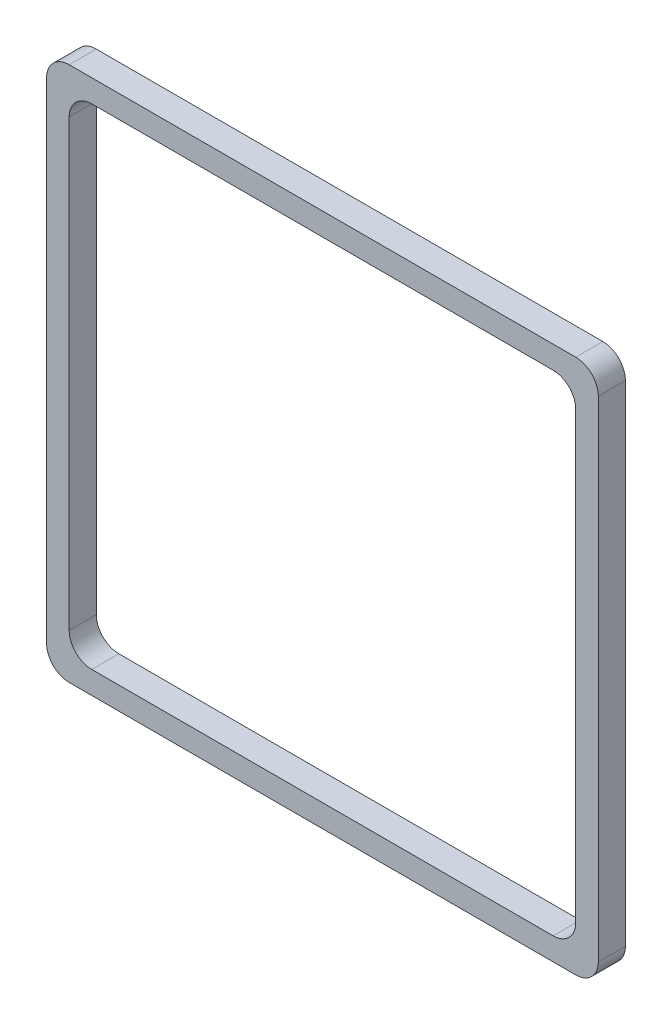
ISO-10303-21;
HEADER;
FILE_DESCRIPTION(('STEP AP214'),'2;1');
FILE_NAME('part.step','',(''),(''),'','','');
FILE_SCHEMA(('AUTOMOTIVE_DESIGN { 1 0 10303 214 1 1 1 1 }'));
ENDSEC;
DATA;
#1=APPLICATION_CONTEXT('core data for automotive mechanical design processes');
#2=APPLICATION_PROTOCOL_DEFINITION('international standard','automotive_design',2000,#1);
#3=PRODUCT_CONTEXT('',#1,'mechanical');
#4=PRODUCT('Part','Part','',(#3));
#5=PRODUCT_RELATED_PRODUCT_CATEGORY('part','',(#4));
#6=PRODUCT_DEFINITION_FORMATION('','',#4);
#7=PRODUCT_DEFINITION_CONTEXT('part definition',#1,'design');
#8=PRODUCT_DEFINITION('design','',#6,#7);
#9=PRODUCT_DEFINITION_SHAPE('','',#8);
#10=(LENGTH_UNIT() NAMED_UNIT(*) SI_UNIT(.MILLI.,.METRE.));
#11=(NAMED_UNIT(*) PLANE_ANGLE_UNIT() SI_UNIT($,.RADIAN.));
#12=(NAMED_UNIT(*) SI_UNIT($,.STERADIAN.) SOLID_ANGLE_UNIT());
#13=UNCERTAINTY_MEASURE_WITH_UNIT(LENGTH_MEASURE(1.E-05),#10,'distance_accuracy_value','');
#14=(GEOMETRIC_REPRESENTATION_CONTEXT(3) GLOBAL_UNCERTAINTY_ASSIGNED_CONTEXT((#13)) GLOBAL_UNIT_ASSIGNED_CONTEXT((#10,
#11,#12)) REPRESENTATION_CONTEXT('',''));
#15=CARTESIAN_POINT('',(0.,0.,0.));
#16=DIRECTION('',(0.,0.,1.));
#17=DIRECTION('',(1.,0.,0.));
#18=AXIS2_PLACEMENT_3D('',#15,#16,#17);
#19=CARTESIAN_POINT('',(204.104097522911,177.840896345193,12.));
#20=DIRECTION('',(0.,0.,-1.));
#21=DIRECTION('',(-1.,0.,0.));
#22=AXIS2_PLACEMENT_3D('',#19,#20,#21);
#23=PLANE('',#22);
#24=CARTESIAN_POINT('',(204.104097522911,177.840896345193,12.));
#25=DIRECTION('',(0.,0.,1.));
#26=DIRECTION('',(-1.,0.,0.));
#27=AXIS2_PLACEMENT_3D('',#24,#25,#26);
#28=CIRCLE('',#27,10.);
#29=CARTESIAN_POINT('',(214.104097522911,177.840896345193,12.));
#30=VERTEX_POINT('',#29);
#31=CARTESIAN_POINT('',(204.104097522911,187.840896345193,12.));
#32=VERTEX_POINT('',#31);
#33=EDGE_CURVE('E242',#30,#32,#28,.T.);
#34=ORIENTED_EDGE('',*,*,#33,.T.);
#35=DIRECTION('',(-1.,0.,0.));
#36=VECTOR('',#35,1.);
#37=CARTESIAN_POINT('',(-20.195902477089,187.840896345193,12.));
#38=LINE('',#37,#36);
#39=CARTESIAN_POINT('',(-20.195902477089,187.840896345193,12.));
#40=VERTEX_POINT('',#39);
#41=EDGE_CURVE('E246',#32,#40,#38,.T.);
#42=ORIENTED_EDGE('',*,*,#41,.T.);
#43=CARTESIAN_POINT('',(-20.195902477089,177.840896345193,12.));
#44=DIRECTION('',(0.,0.,1.));
#45=DIRECTION('',(1.,0.,0.));
#46=AXIS2_PLACEMENT_3D('',#43,#44,#45);
#47=CIRCLE('',#46,9.99999999999999);
#48=CARTESIAN_POINT('',(-30.195902477089,177.840896345193,12.));
#49=VERTEX_POINT('',#48);
#50=EDGE_CURVE('E250',#40,#49,#47,.T.);
#51=ORIENTED_EDGE('',*,*,#50,.T.);
#52=DIRECTION('',(0.,-1.,0.));
#53=VECTOR('',#52,1.);
#54=CARTESIAN_POINT('',(-30.195902477089,177.840896345193,12.));
#55=LINE('',#54,#53);
#56=CARTESIAN_POINT('',(-30.195902477089,-39.0591036548066,12.));
#57=VERTEX_POINT('',#56);
#58=EDGE_CURVE('E253',#49,#57,#55,.T.);
#59=ORIENTED_EDGE('',*,*,#58,.T.);
#60=CARTESIAN_POINT('',(-20.195902477089,-39.0591036548066,12.));
#61=DIRECTION('',(0.,0.,1.));
#62=DIRECTION('',(1.,0.,0.));
#63=AXIS2_PLACEMENT_3D('',#60,#61,#62);
#64=CIRCLE('',#63,10.);
#65=CARTESIAN_POINT('',(-20.195902477089,-49.0591036548066,12.));
#66=VERTEX_POINT('',#65);
#67=EDGE_CURVE('E256',#57,#66,#64,.T.);
#68=ORIENTED_EDGE('',*,*,#67,.T.);
#69=DIRECTION('',(1.,0.,0.));
#70=VECTOR('',#69,1.);
#71=CARTESIAN_POINT('',(-20.195902477089,-49.0591036548066,12.));
#72=LINE('',#71,#70);
#73=CARTESIAN_POINT('',(204.104097522911,-49.0591036548066,12.));
#74=VERTEX_POINT('',#73);
#75=EDGE_CURVE('E259',#66,#74,#72,.T.);
#76=ORIENTED_EDGE('',*,*,#75,.T.);
#77=CARTESIAN_POINT('',(204.104097522911,-39.0591036548066,12.));
#78=DIRECTION('',(0.,0.,1.));
#79=DIRECTION('',(1.,0.,0.));
#80=AXIS2_PLACEMENT_3D('',#77,#78,#79);
#81=CIRCLE('',#80,10.);
#82=CARTESIAN_POINT('',(214.104097522911,-39.0591036548066,12.));
#83=VERTEX_POINT('',#82);
#84=EDGE_CURVE('E262',#74,#83,#81,.T.);
#85=ORIENTED_EDGE('',*,*,#84,.T.);
#86=DIRECTION('',(0.,1.,0.));
#87=VECTOR('',#86,1.);
#88=CARTESIAN_POINT('',(214.104097522911,177.840896345193,12.));
#89=LINE('',#88,#87);
#90=EDGE_CURVE('E265',#83,#30,#89,.T.);
#91=ORIENTED_EDGE('',*,*,#90,.T.);
#92=EDGE_LOOP('',(#34,#42,#51,#59,#68,#76,#85,#91));
#93=FACE_BOUND('',#92,.T.);
#94=CARTESIAN_POINT('',(194.104097522911,-29.0591036548066,12.));
#95=DIRECTION('',(0.,0.,1.));
#96=DIRECTION('',(1.,0.,0.));
#97=AXIS2_PLACEMENT_3D('',#94,#95,#96);
#98=CIRCLE('',#97,10.);
#99=CARTESIAN_POINT('',(194.104097522911,-39.0591036548066,12.));
#100=VERTEX_POINT('',#99);
#101=CARTESIAN_POINT('',(204.104097522911,-29.0591036548066,12.));
#102=VERTEX_POINT('',#101);
#103=EDGE_CURVE('E153',#100,#102,#98,.T.);
#104=ORIENTED_EDGE('',*,*,#103,.F.);
#105=DIRECTION('',(1.,0.,0.));
#106=VECTOR('',#105,1.);
#107=CARTESIAN_POINT('',(-10.195902477089,-39.0591036548066,12.));
#108=LINE('',#107,#106);
#109=CARTESIAN_POINT('',(-10.195902477089,-39.0591036548066,12.));
#110=VERTEX_POINT('',#109);
#111=EDGE_CURVE('E194',#110,#100,#108,.T.);
#112=ORIENTED_EDGE('',*,*,#111,.F.);
#113=CARTESIAN_POINT('',(-10.195902477089,-29.0591036548066,12.));
#114=DIRECTION('',(0.,0.,1.));
#115=DIRECTION('',(1.,0.,0.));
#116=AXIS2_PLACEMENT_3D('',#113,#114,#115);
#117=CIRCLE('',#116,10.);
#118=CARTESIAN_POINT('',(-20.195902477089,-29.0591036548066,12.));
#119=VERTEX_POINT('',#118);
#120=EDGE_CURVE('E191',#119,#110,#117,.T.);
#121=ORIENTED_EDGE('',*,*,#120,.F.);
#122=DIRECTION('',(0.,-1.,0.));
#123=VECTOR('',#122,1.);
#124=CARTESIAN_POINT('',(-20.195902477089,167.840896345193,12.));
#125=LINE('',#124,#123);
#126=CARTESIAN_POINT('',(-20.195902477089,167.840896345193,12.));
#127=VERTEX_POINT('',#126);
#128=EDGE_CURVE('E188',#127,#119,#125,.T.);
#129=ORIENTED_EDGE('',*,*,#128,.F.);
#130=CARTESIAN_POINT('',(-10.195902477089,167.840896345193,12.));
#131=DIRECTION('',(0.,0.,1.));
#132=DIRECTION('',(1.,0.,0.));
#133=AXIS2_PLACEMENT_3D('',#130,#131,#132);
#134=CIRCLE('',#133,10.);
#135=CARTESIAN_POINT('',(-10.195902477089,177.840896345193,12.));
#136=VERTEX_POINT('',#135);
#137=EDGE_CURVE('E185',#136,#127,#134,.T.);
#138=ORIENTED_EDGE('',*,*,#137,.F.);
#139=DIRECTION('',(-1.,0.,0.));
#140=VECTOR('',#139,1.);
#141=CARTESIAN_POINT('',(-10.195902477089,177.840896345193,12.));
#142=LINE('',#141,#140);
#143=CARTESIAN_POINT('',(194.104097522911,177.840896345193,12.));
#144=VERTEX_POINT('',#143);
#145=EDGE_CURVE('E180',#144,#136,#142,.T.);
#146=ORIENTED_EDGE('',*,*,#145,.F.);
#147=CARTESIAN_POINT('',(194.104097522911,167.840896345193,12.));
#148=DIRECTION('',(0.,0.,1.));
#149=DIRECTION('',(-1.,0.,0.));
#150=AXIS2_PLACEMENT_3D('',#147,#148,#149);
#151=CIRCLE('',#150,10.);
#152=CARTESIAN_POINT('',(204.104097522911,167.840896345193,12.));
#153=VERTEX_POINT('',#152);
#154=EDGE_CURVE('E176',#153,#144,#151,.T.);
#155=ORIENTED_EDGE('',*,*,#154,.F.);
#156=DIRECTION('',(0.,1.,0.));
#157=VECTOR('',#156,1.);
#158=CARTESIAN_POINT('',(204.104097522911,167.840896345193,12.));
#159=LINE('',#158,#157);
#160=EDGE_CURVE('E162',#102,#153,#159,.T.);
#161=ORIENTED_EDGE('',*,*,#160,.F.);
#162=EDGE_LOOP('',(#104,#112,#121,#129,#138,#146,#155,#161));
#163=FACE_BOUND('',#162,.T.);
#164=ADVANCED_FACE('F39',(#93,#163),#23,.F.);
#165=CARTESIAN_POINT('',(204.104097522911,177.840896345193,0.));
#166=DIRECTION('',(0.,0.,-1.));
#167=DIRECTION('',(-1.,0.,0.));
#168=AXIS2_PLACEMENT_3D('',#165,#166,#167);
#169=PLANE('',#168);
#170=CARTESIAN_POINT('',(204.104097522911,177.840896345193,0.));
#171=DIRECTION('',(0.,0.,1.));
#172=DIRECTION('',(-1.,0.,0.));
#173=AXIS2_PLACEMENT_3D('',#170,#171,#172);
#174=CIRCLE('',#173,10.);
#175=CARTESIAN_POINT('',(214.104097522911,177.840896345193,0.));
#176=VERTEX_POINT('',#175);
#177=CARTESIAN_POINT('',(204.104097522911,187.840896345193,0.));
#178=VERTEX_POINT('',#177);
#179=EDGE_CURVE('E171',#176,#178,#174,.T.);
#180=ORIENTED_EDGE('',*,*,#179,.F.);
#181=DIRECTION('',(0.,1.,0.));
#182=VECTOR('',#181,1.);
#183=CARTESIAN_POINT('',(214.104097522911,177.840896345193,0.));
#184=LINE('',#183,#182);
#185=CARTESIAN_POINT('',(214.104097522911,-39.0591036548066,0.));
#186=VERTEX_POINT('',#185);
#187=EDGE_CURVE('E247',#186,#176,#184,.T.);
#188=ORIENTED_EDGE('',*,*,#187,.F.);
#189=CARTESIAN_POINT('',(204.104097522911,-39.0591036548066,0.));
#190=DIRECTION('',(0.,0.,1.));
#191=DIRECTION('',(1.,0.,0.));
#192=AXIS2_PLACEMENT_3D('',#189,#190,#191);
#193=CIRCLE('',#192,10.);
#194=CARTESIAN_POINT('',(204.104097522911,-49.0591036548066,0.));
#195=VERTEX_POINT('',#194);
#196=EDGE_CURVE('E287',#195,#186,#193,.T.);
#197=ORIENTED_EDGE('',*,*,#196,.F.);
#198=DIRECTION('',(1.,0.,0.));
#199=VECTOR('',#198,1.);
#200=CARTESIAN_POINT('',(-20.195902477089,-49.0591036548066,0.));
#201=LINE('',#200,#199);
#202=CARTESIAN_POINT('',(-20.195902477089,-49.0591036548066,0.));
#203=VERTEX_POINT('',#202);
#204=EDGE_CURVE('E284',#203,#195,#201,.T.);
#205=ORIENTED_EDGE('',*,*,#204,.F.);
#206=CARTESIAN_POINT('',(-20.195902477089,-39.0591036548066,0.));
#207=DIRECTION('',(0.,0.,1.));
#208=DIRECTION('',(1.,0.,0.));
#209=AXIS2_PLACEMENT_3D('',#206,#207,#208);
#210=CIRCLE('',#209,10.);
#211=CARTESIAN_POINT('',(-30.195902477089,-39.0591036548066,0.));
#212=VERTEX_POINT('',#211);
#213=EDGE_CURVE('E281',#212,#203,#210,.T.);
#214=ORIENTED_EDGE('',*,*,#213,.F.);
#215=DIRECTION('',(0.,-1.,0.));
#216=VECTOR('',#215,1.);
#217=CARTESIAN_POINT('',(-30.195902477089,177.840896345193,0.));
#218=LINE('',#217,#216);
#219=CARTESIAN_POINT('',(-30.195902477089,177.840896345193,0.));
#220=VERTEX_POINT('',#219);
#221=EDGE_CURVE('E278',#220,#212,#218,.T.);
#222=ORIENTED_EDGE('',*,*,#221,.F.);
#223=CARTESIAN_POINT('',(-20.195902477089,177.840896345193,0.));
#224=DIRECTION('',(0.,0.,1.));
#225=DIRECTION('',(1.,0.,0.));
#226=AXIS2_PLACEMENT_3D('',#223,#224,#225);
#227=CIRCLE('',#226,9.99999999999999);
#228=CARTESIAN_POINT('',(-20.195902477089,187.840896345193,0.));
#229=VERTEX_POINT('',#228);
#230=EDGE_CURVE('E275',#229,#220,#227,.T.);
#231=ORIENTED_EDGE('',*,*,#230,.F.);
#232=DIRECTION('',(-1.,0.,0.));
#233=VECTOR('',#232,1.);
#234=CARTESIAN_POINT('',(-20.195902477089,187.840896345193,0.));
#235=LINE('',#234,#233);
#236=EDGE_CURVE('E272',#178,#229,#235,.T.);
#237=ORIENTED_EDGE('',*,*,#236,.F.);
#238=EDGE_LOOP('',(#180,#188,#197,#205,#214,#222,#231,#237));
#239=FACE_BOUND('',#238,.T.);
#240=DIRECTION('',(1.,0.,0.));
#241=VECTOR('',#240,1.);
#242=CARTESIAN_POINT('',(-10.195902477089,-39.0591036548066,0.));
#243=LINE('',#242,#241);
#244=CARTESIAN_POINT('',(-10.195902477089,-39.0591036548066,0.));
#245=VERTEX_POINT('',#244);
#246=CARTESIAN_POINT('',(194.104097522911,-39.0591036548066,0.));
#247=VERTEX_POINT('',#246);
#248=EDGE_CURVE('E163',#245,#247,#243,.T.);
#249=ORIENTED_EDGE('',*,*,#248,.T.);
#250=CARTESIAN_POINT('',(194.104097522911,-29.0591036548066,0.));
#251=DIRECTION('',(0.,0.,1.));
#252=DIRECTION('',(1.,0.,0.));
#253=AXIS2_PLACEMENT_3D('',#250,#251,#252);
#254=CIRCLE('',#253,10.);
#255=CARTESIAN_POINT('',(204.104097522911,-29.0591036548066,0.));
#256=VERTEX_POINT('',#255);
#257=EDGE_CURVE('E63',#247,#256,#254,.T.);
#258=ORIENTED_EDGE('',*,*,#257,.T.);
#259=DIRECTION('',(0.,1.,0.));
#260=VECTOR('',#259,1.);
#261=CARTESIAN_POINT('',(204.104097522911,167.840896345193,0.));
#262=LINE('',#261,#260);
#263=CARTESIAN_POINT('',(204.104097522911,167.840896345193,0.));
#264=VERTEX_POINT('',#263);
#265=EDGE_CURVE('E169',#256,#264,#262,.T.);
#266=ORIENTED_EDGE('',*,*,#265,.T.);
#267=CARTESIAN_POINT('',(194.104097522911,167.840896345193,0.));
#268=DIRECTION('',(0.,0.,1.));
#269=DIRECTION('',(-1.,0.,0.));
#270=AXIS2_PLACEMENT_3D('',#267,#268,#269);
#271=CIRCLE('',#270,10.);
#272=CARTESIAN_POINT('',(194.104097522911,177.840896345193,0.));
#273=VERTEX_POINT('',#272);
#274=EDGE_CURVE('E201',#264,#273,#271,.T.);
#275=ORIENTED_EDGE('',*,*,#274,.T.);
#276=DIRECTION('',(-1.,0.,0.));
#277=VECTOR('',#276,1.);
#278=CARTESIAN_POINT('',(-10.195902477089,177.840896345193,0.));
#279=LINE('',#278,#277);
#280=CARTESIAN_POINT('',(-10.195902477089,177.840896345193,0.));
#281=VERTEX_POINT('',#280);
#282=EDGE_CURVE('E205',#273,#281,#279,.T.);
#283=ORIENTED_EDGE('',*,*,#282,.T.);
#284=CARTESIAN_POINT('',(-10.195902477089,167.840896345193,0.));
#285=DIRECTION('',(0.,0.,1.));
#286=DIRECTION('',(1.,0.,0.));
#287=AXIS2_PLACEMENT_3D('',#284,#285,#286);
#288=CIRCLE('',#287,10.);
#289=CARTESIAN_POINT('',(-20.195902477089,167.840896345193,0.));
#290=VERTEX_POINT('',#289);
#291=EDGE_CURVE('E209',#281,#290,#288,.T.);
#292=ORIENTED_EDGE('',*,*,#291,.T.);
#293=DIRECTION('',(0.,-1.,0.));
#294=VECTOR('',#293,1.);
#295=CARTESIAN_POINT('',(-20.195902477089,167.840896345193,0.));
#296=LINE('',#295,#294);
#297=CARTESIAN_POINT('',(-20.195902477089,-29.0591036548066,0.));
#298=VERTEX_POINT('',#297);
#299=EDGE_CURVE('E213',#290,#298,#296,.T.);
#300=ORIENTED_EDGE('',*,*,#299,.T.);
#301=CARTESIAN_POINT('',(-10.195902477089,-29.0591036548066,0.));
#302=DIRECTION('',(0.,0.,1.));
#303=DIRECTION('',(1.,0.,0.));
#304=AXIS2_PLACEMENT_3D('',#301,#302,#303);
#305=CIRCLE('',#304,10.);
#306=EDGE_CURVE('E217',#298,#245,#305,.T.);
#307=ORIENTED_EDGE('',*,*,#306,.T.);
#308=EDGE_LOOP('',(#249,#258,#266,#275,#283,#292,#300,#307));
#309=FACE_BOUND('',#308,.T.);
#310=ADVANCED_FACE('F326',(#239,#309),#169,.T.);
#311=CARTESIAN_POINT('',(204.104097522911,177.840896345193,12.));
#312=DIRECTION('',(0.,0.,-1.));
#313=DIRECTION('',(-1.,0.,0.));
#314=AXIS2_PLACEMENT_3D('',#311,#312,#313);
#315=CYLINDRICAL_SURFACE('',#314,10.);
#316=ORIENTED_EDGE('',*,*,#179,.T.);
#317=DIRECTION('',(0.,0.,-1.));
#318=VECTOR('',#317,1.);
#319=CARTESIAN_POINT('',(204.104097522911,187.840896345193,12.));
#320=LINE('',#319,#318);
#321=EDGE_CURVE('E11',#32,#178,#320,.T.);
#322=ORIENTED_EDGE('',*,*,#321,.F.);
#323=ORIENTED_EDGE('',*,*,#33,.F.);
#324=DIRECTION('',(0.,0.,-1.));
#325=VECTOR('',#324,1.);
#326=CARTESIAN_POINT('',(214.104097522911,177.840896345193,12.));
#327=LINE('',#326,#325);
#328=EDGE_CURVE('E268',#30,#176,#327,.T.);
#329=ORIENTED_EDGE('',*,*,#328,.T.);
#330=EDGE_LOOP('',(#316,#322,#323,#329));
#331=FACE_BOUND('',#330,.T.);
#332=ADVANCED_FACE('F41',(#331),#315,.T.);
#333=CARTESIAN_POINT('',(-20.195902477089,187.840896345193,12.));
#334=DIRECTION('',(0.,-1.,0.));
#335=DIRECTION('',(0.,0.,-1.));
#336=AXIS2_PLACEMENT_3D('',#333,#334,#335);
#337=PLANE('',#336);
#338=ORIENTED_EDGE('',*,*,#236,.T.);
#339=DIRECTION('',(0.,0.,-1.));
#340=VECTOR('',#339,1.);
#341=CARTESIAN_POINT('',(-20.195902477089,187.840896345193,12.));
#342=LINE('',#341,#340);
#343=EDGE_CURVE('E48',#40,#229,#342,.T.);
#344=ORIENTED_EDGE('',*,*,#343,.F.);
#345=ORIENTED_EDGE('',*,*,#41,.F.);
#346=ORIENTED_EDGE('',*,*,#321,.T.);
#347=EDGE_LOOP('',(#338,#344,#345,#346));
#348=FACE_BOUND('',#347,.T.);
#349=ADVANCED_FACE('F343',(#348),#337,.F.);
#350=CARTESIAN_POINT('',(-20.195902477089,177.840896345193,12.));
#351=DIRECTION('',(0.,0.,-1.));
#352=DIRECTION('',(-1.,0.,0.));
#353=AXIS2_PLACEMENT_3D('',#350,#351,#352);
#354=CYLINDRICAL_SURFACE('',#353,9.99999999999999);
#355=ORIENTED_EDGE('',*,*,#230,.T.);
#356=DIRECTION('',(0.,0.,-1.));
#357=VECTOR('',#356,1.);
#358=CARTESIAN_POINT('',(-30.195902477089,177.840896345193,12.));
#359=LINE('',#358,#357);
#360=EDGE_CURVE('E311',#49,#220,#359,.T.);
#361=ORIENTED_EDGE('',*,*,#360,.F.);
#362=ORIENTED_EDGE('',*,*,#50,.F.);
#363=ORIENTED_EDGE('',*,*,#343,.T.);
#364=EDGE_LOOP('',(#355,#361,#362,#363));
#365=FACE_BOUND('',#364,.T.);
#366=ADVANCED_FACE('F320',(#365),#354,.T.);
#367=CARTESIAN_POINT('',(-30.195902477089,177.840896345193,12.));
#368=DIRECTION('',(1.,0.,0.));
#369=DIRECTION('',(0.,1.,0.));
#370=AXIS2_PLACEMENT_3D('',#367,#368,#369);
#371=PLANE('',#370);
#372=ORIENTED_EDGE('',*,*,#221,.T.);
#373=DIRECTION('',(0.,0.,-1.));
#374=VECTOR('',#373,1.);
#375=CARTESIAN_POINT('',(-30.195902477089,-39.0591036548066,12.));
#376=LINE('',#375,#374);
#377=EDGE_CURVE('E307',#57,#212,#376,.T.);
#378=ORIENTED_EDGE('',*,*,#377,.F.);
#379=ORIENTED_EDGE('',*,*,#58,.F.);
#380=ORIENTED_EDGE('',*,*,#360,.T.);
#381=EDGE_LOOP('',(#372,#378,#379,#380));
#382=FACE_BOUND('',#381,.T.);
#383=ADVANCED_FACE('F332',(#382),#371,.F.);
#384=CARTESIAN_POINT('',(-20.195902477089,-39.0591036548066,12.));
#385=DIRECTION('',(0.,0.,-1.));
#386=DIRECTION('',(-1.,0.,0.));
#387=AXIS2_PLACEMENT_3D('',#384,#385,#386);
#388=CYLINDRICAL_SURFACE('',#387,10.);
#389=ORIENTED_EDGE('',*,*,#213,.T.);
#390=DIRECTION('',(0.,0.,-1.));
#391=VECTOR('',#390,1.);
#392=CARTESIAN_POINT('',(-20.195902477089,-49.0591036548066,12.));
#393=LINE('',#392,#391);
#394=EDGE_CURVE('E303',#66,#203,#393,.T.);
#395=ORIENTED_EDGE('',*,*,#394,.F.);
#396=ORIENTED_EDGE('',*,*,#67,.F.);
#397=ORIENTED_EDGE('',*,*,#377,.T.);
#398=EDGE_LOOP('',(#389,#395,#396,#397));
#399=FACE_BOUND('',#398,.T.);
#400=ADVANCED_FACE('F336',(#399),#388,.T.);
#401=CARTESIAN_POINT('',(-20.195902477089,-49.0591036548066,12.));
#402=DIRECTION('',(0.,1.,0.));
#403=DIRECTION('',(-1.,0.,0.));
#404=AXIS2_PLACEMENT_3D('',#401,#402,#403);
#405=PLANE('',#404);
#406=ORIENTED_EDGE('',*,*,#204,.T.);
#407=DIRECTION('',(0.,0.,-1.));
#408=VECTOR('',#407,1.);
#409=CARTESIAN_POINT('',(204.104097522911,-49.0591036548066,12.));
#410=LINE('',#409,#408);
#411=EDGE_CURVE('E299',#74,#195,#410,.T.);
#412=ORIENTED_EDGE('',*,*,#411,.F.);
#413=ORIENTED_EDGE('',*,*,#75,.F.);
#414=ORIENTED_EDGE('',*,*,#394,.T.);
#415=EDGE_LOOP('',(#406,#412,#413,#414));
#416=FACE_BOUND('',#415,.T.);
#417=ADVANCED_FACE('F356',(#416),#405,.F.);
#418=CARTESIAN_POINT('',(204.104097522911,-39.0591036548066,12.));
#419=DIRECTION('',(0.,0.,-1.));
#420=DIRECTION('',(-1.,0.,0.));
#421=AXIS2_PLACEMENT_3D('',#418,#419,#420);
#422=CYLINDRICAL_SURFACE('',#421,10.);
#423=ORIENTED_EDGE('',*,*,#196,.T.);
#424=DIRECTION('',(0.,0.,-1.));
#425=VECTOR('',#424,1.);
#426=CARTESIAN_POINT('',(214.104097522911,-39.0591036548066,12.));
#427=LINE('',#426,#425);
#428=EDGE_CURVE('E295',#83,#186,#427,.T.);
#429=ORIENTED_EDGE('',*,*,#428,.F.);
#430=ORIENTED_EDGE('',*,*,#84,.F.);
#431=ORIENTED_EDGE('',*,*,#411,.T.);
#432=EDGE_LOOP('',(#423,#429,#430,#431));
#433=FACE_BOUND('',#432,.T.);
#434=ADVANCED_FACE('F354',(#433),#422,.T.);
#435=CARTESIAN_POINT('',(214.104097522911,177.840896345193,12.));
#436=DIRECTION('',(-1.,0.,0.));
#437=DIRECTION('',(0.,-1.,0.));
#438=AXIS2_PLACEMENT_3D('',#435,#436,#437);
#439=PLANE('',#438);
#440=ORIENTED_EDGE('',*,*,#187,.T.);
#441=ORIENTED_EDGE('',*,*,#328,.F.);
#442=ORIENTED_EDGE('',*,*,#90,.F.);
#443=ORIENTED_EDGE('',*,*,#428,.T.);
#444=EDGE_LOOP('',(#440,#441,#442,#443));
#445=FACE_BOUND('',#444,.T.);
#446=ADVANCED_FACE('F349',(#445),#439,.F.);
#447=CARTESIAN_POINT('',(194.104097522911,-29.0591036548066,12.));
#448=DIRECTION('',(0.,0.,-1.));
#449=DIRECTION('',(-1.,0.,0.));
#450=AXIS2_PLACEMENT_3D('',#447,#448,#449);
#451=CYLINDRICAL_SURFACE('',#450,10.);
#452=ORIENTED_EDGE('',*,*,#257,.F.);
#453=DIRECTION('',(0.,0.,-1.));
#454=VECTOR('',#453,1.);
#455=CARTESIAN_POINT('',(194.104097522911,-39.0591036548066,12.));
#456=LINE('',#455,#454);
#457=EDGE_CURVE('E157',#100,#247,#456,.T.);
#458=ORIENTED_EDGE('',*,*,#457,.F.);
#459=ORIENTED_EDGE('',*,*,#103,.T.);
#460=DIRECTION('',(0.,0.,-1.));
#461=VECTOR('',#460,1.);
#462=CARTESIAN_POINT('',(204.104097522911,-29.0591036548066,12.));
#463=LINE('',#462,#461);
#464=EDGE_CURVE('E156',#102,#256,#463,.T.);
#465=ORIENTED_EDGE('',*,*,#464,.T.);
#466=EDGE_LOOP('',(#452,#458,#459,#465));
#467=FACE_BOUND('',#466,.T.);
#468=ADVANCED_FACE('F155',(#467),#451,.F.);
#469=CARTESIAN_POINT('',(204.104097522911,167.840896345193,12.));
#470=DIRECTION('',(-1.,0.,0.));
#471=DIRECTION('',(0.,-1.,0.));
#472=AXIS2_PLACEMENT_3D('',#469,#470,#471);
#473=PLANE('',#472);
#474=ORIENTED_EDGE('',*,*,#265,.F.);
#475=ORIENTED_EDGE('',*,*,#464,.F.);
#476=ORIENTED_EDGE('',*,*,#160,.T.);
#477=DIRECTION('',(0.,0.,-1.));
#478=VECTOR('',#477,1.);
#479=CARTESIAN_POINT('',(204.104097522911,167.840896345193,12.));
#480=LINE('',#479,#478);
#481=EDGE_CURVE('E172',#153,#264,#480,.T.);
#482=ORIENTED_EDGE('',*,*,#481,.T.);
#483=EDGE_LOOP('',(#474,#475,#476,#482));
#484=FACE_BOUND('',#483,.T.);
#485=ADVANCED_FACE('F166',(#484),#473,.T.);
#486=CARTESIAN_POINT('',(194.104097522911,167.840896345193,12.));
#487=DIRECTION('',(0.,0.,-1.));
#488=DIRECTION('',(-1.,0.,0.));
#489=AXIS2_PLACEMENT_3D('',#486,#487,#488);
#490=CYLINDRICAL_SURFACE('',#489,10.);
#491=ORIENTED_EDGE('',*,*,#274,.F.);
#492=ORIENTED_EDGE('',*,*,#481,.F.);
#493=ORIENTED_EDGE('',*,*,#154,.T.);
#494=DIRECTION('',(0.,0.,-1.));
#495=VECTOR('',#494,1.);
#496=CARTESIAN_POINT('',(194.104097522911,177.840896345193,12.));
#497=LINE('',#496,#495);
#498=EDGE_CURVE('E237',#144,#273,#497,.T.);
#499=ORIENTED_EDGE('',*,*,#498,.T.);
#500=EDGE_LOOP('',(#491,#492,#493,#499));
#501=FACE_BOUND('',#500,.T.);
#502=ADVANCED_FACE('F381',(#501),#490,.F.);
#503=CARTESIAN_POINT('',(-10.195902477089,177.840896345193,12.));
#504=DIRECTION('',(0.,-1.,0.));
#505=DIRECTION('',(1.,0.,0.));
#506=AXIS2_PLACEMENT_3D('',#503,#504,#505);
#507=PLANE('',#506);
#508=ORIENTED_EDGE('',*,*,#282,.F.);
#509=ORIENTED_EDGE('',*,*,#498,.F.);
#510=ORIENTED_EDGE('',*,*,#145,.T.);
#511=DIRECTION('',(0.,0.,-1.));
#512=VECTOR('',#511,1.);
#513=CARTESIAN_POINT('',(-10.195902477089,177.840896345193,12.));
#514=LINE('',#513,#512);
#515=EDGE_CURVE('E234',#136,#281,#514,.T.);
#516=ORIENTED_EDGE('',*,*,#515,.T.);
#517=EDGE_LOOP('',(#508,#509,#510,#516));
#518=FACE_BOUND('',#517,.T.);
#519=ADVANCED_FACE('F385',(#518),#507,.T.);
#520=CARTESIAN_POINT('',(-10.195902477089,167.840896345193,12.));
#521=DIRECTION('',(0.,0.,-1.));
#522=DIRECTION('',(-1.,0.,0.));
#523=AXIS2_PLACEMENT_3D('',#520,#521,#522);
#524=CYLINDRICAL_SURFACE('',#523,10.);
#525=ORIENTED_EDGE('',*,*,#291,.F.);
#526=ORIENTED_EDGE('',*,*,#515,.F.);
#527=ORIENTED_EDGE('',*,*,#137,.T.);
#528=DIRECTION('',(0.,0.,-1.));
#529=VECTOR('',#528,1.);
#530=CARTESIAN_POINT('',(-20.195902477089,167.840896345193,12.));
#531=LINE('',#530,#529);
#532=EDGE_CURVE('E231',#127,#290,#531,.T.);
#533=ORIENTED_EDGE('',*,*,#532,.T.);
#534=EDGE_LOOP('',(#525,#526,#527,#533));
#535=FACE_BOUND('',#534,.T.);
#536=ADVANCED_FACE('F391',(#535),#524,.F.);
#537=CARTESIAN_POINT('',(-20.195902477089,167.840896345193,12.));
#538=DIRECTION('',(1.,0.,0.));
#539=DIRECTION('',(0.,1.,0.));
#540=AXIS2_PLACEMENT_3D('',#537,#538,#539);
#541=PLANE('',#540);
#542=ORIENTED_EDGE('',*,*,#299,.F.);
#543=ORIENTED_EDGE('',*,*,#532,.F.);
#544=ORIENTED_EDGE('',*,*,#128,.T.);
#545=DIRECTION('',(0.,0.,-1.));
#546=VECTOR('',#545,1.);
#547=CARTESIAN_POINT('',(-20.195902477089,-29.0591036548066,12.));
#548=LINE('',#547,#546);
#549=EDGE_CURVE('E228',#119,#298,#548,.T.);
#550=ORIENTED_EDGE('',*,*,#549,.T.);
#551=EDGE_LOOP('',(#542,#543,#544,#550));
#552=FACE_BOUND('',#551,.T.);
#553=ADVANCED_FACE('F395',(#552),#541,.T.);
#554=CARTESIAN_POINT('',(-10.195902477089,-29.0591036548066,12.));
#555=DIRECTION('',(0.,0.,-1.));
#556=DIRECTION('',(-1.,0.,0.));
#557=AXIS2_PLACEMENT_3D('',#554,#555,#556);
#558=CYLINDRICAL_SURFACE('',#557,10.);
#559=ORIENTED_EDGE('',*,*,#306,.F.);
#560=ORIENTED_EDGE('',*,*,#549,.F.);
#561=ORIENTED_EDGE('',*,*,#120,.T.);
#562=DIRECTION('',(0.,0.,-1.));
#563=VECTOR('',#562,1.);
#564=CARTESIAN_POINT('',(-10.195902477089,-39.0591036548066,12.));
#565=LINE('',#564,#563);
#566=EDGE_CURVE('E55',#110,#245,#565,.T.);
#567=ORIENTED_EDGE('',*,*,#566,.T.);
#568=EDGE_LOOP('',(#559,#560,#561,#567));
#569=FACE_BOUND('',#568,.T.);
#570=ADVANCED_FACE('F399',(#569),#558,.F.);
#571=CARTESIAN_POINT('',(-10.195902477089,-39.0591036548066,12.));
#572=DIRECTION('',(0.,1.,0.));
#573=DIRECTION('',(-1.,0.,0.));
#574=AXIS2_PLACEMENT_3D('',#571,#572,#573);
#575=PLANE('',#574);
#576=ORIENTED_EDGE('',*,*,#248,.F.);
#577=ORIENTED_EDGE('',*,*,#566,.F.);
#578=ORIENTED_EDGE('',*,*,#111,.T.);
#579=ORIENTED_EDGE('',*,*,#457,.T.);
#580=EDGE_LOOP('',(#576,#577,#578,#579));
#581=FACE_BOUND('',#580,.T.);
#582=ADVANCED_FACE('F403',(#581),#575,.T.);
#583=CLOSED_SHELL('',(#164,#310,#332,#349,#366,#383,#400,#417,#434,#446,#468,#485,#502,#519,
#536,#553,#570,#582));
#584=MANIFOLD_SOLID_BREP('B2',#583);
#585=ADVANCED_BREP_SHAPE_REPRESENTATION('',(#18,#584),#14);
#586=SHAPE_DEFINITION_REPRESENTATION(#9,#585);
ENDSEC;
END-ISO-10303-21;
